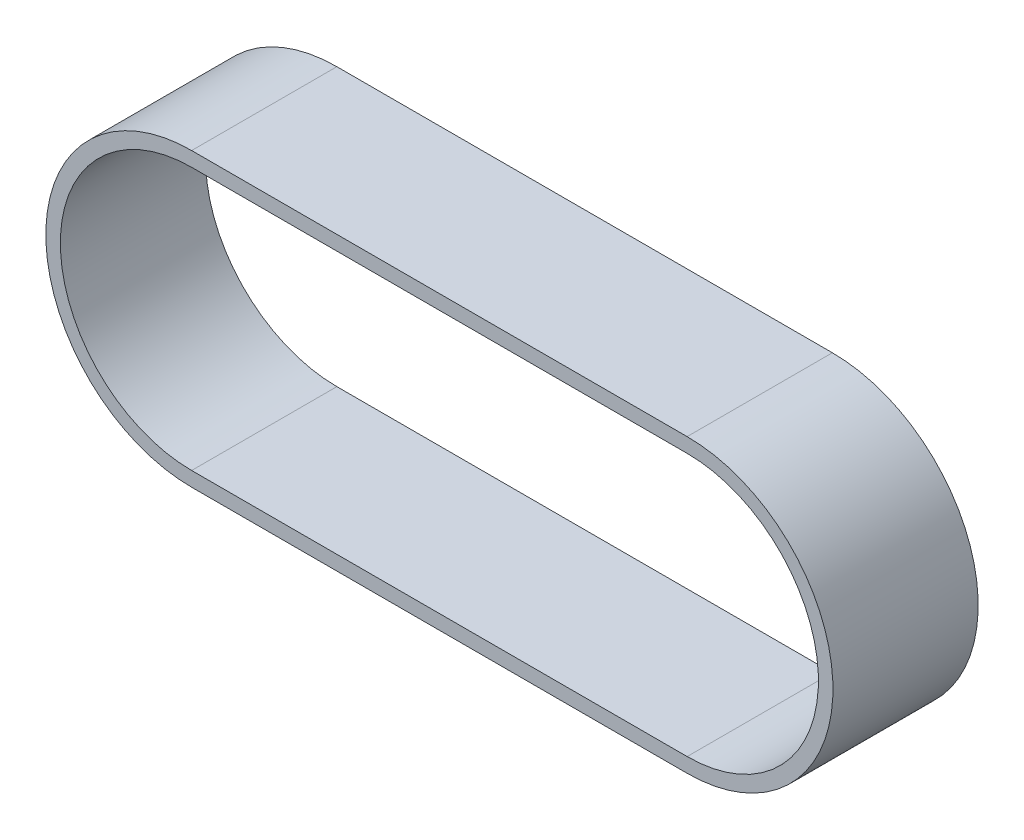
ISO-10303-21;
HEADER;
FILE_DESCRIPTION(('STEP AP214'),'2;1');
FILE_NAME('part.step','',(''),(''),'','','');
FILE_SCHEMA(('AUTOMOTIVE_DESIGN { 1 0 10303 214 1 1 1 1 }'));
ENDSEC;
DATA;
#1=APPLICATION_CONTEXT('core data for automotive mechanical design processes');
#2=APPLICATION_PROTOCOL_DEFINITION('international standard','automotive_design',2000,#1);
#3=PRODUCT_CONTEXT('',#1,'mechanical');
#4=PRODUCT('Part','Part','',(#3));
#5=PRODUCT_RELATED_PRODUCT_CATEGORY('part','',(#4));
#6=PRODUCT_DEFINITION_FORMATION('','',#4);
#7=PRODUCT_DEFINITION_CONTEXT('part definition',#1,'design');
#8=PRODUCT_DEFINITION('design','',#6,#7);
#9=PRODUCT_DEFINITION_SHAPE('','',#8);
#10=(LENGTH_UNIT() NAMED_UNIT(*) SI_UNIT(.MILLI.,.METRE.));
#11=(NAMED_UNIT(*) PLANE_ANGLE_UNIT() SI_UNIT($,.RADIAN.));
#12=(NAMED_UNIT(*) SI_UNIT($,.STERADIAN.) SOLID_ANGLE_UNIT());
#13=UNCERTAINTY_MEASURE_WITH_UNIT(LENGTH_MEASURE(1.E-05),#10,'distance_accuracy_value','');
#14=(GEOMETRIC_REPRESENTATION_CONTEXT(3) GLOBAL_UNCERTAINTY_ASSIGNED_CONTEXT((#13)) GLOBAL_UNIT_ASSIGNED_CONTEXT((#10,
#11,#12)) REPRESENTATION_CONTEXT('',''));
#15=CARTESIAN_POINT('',(0.,0.,0.));
#16=DIRECTION('',(0.,0.,1.));
#17=DIRECTION('',(1.,0.,0.));
#18=AXIS2_PLACEMENT_3D('',#15,#16,#17);
#19=CARTESIAN_POINT('',(17.06,0.,2.5));
#20=DIRECTION('',(0.,0.,1.));
#21=DIRECTION('',(1.,0.,0.));
#22=AXIS2_PLACEMENT_3D('',#19,#20,#21);
#23=PLANE('',#22);
#24=CARTESIAN_POINT('',(17.06,0.,2.5));
#25=DIRECTION('',(0.,0.,1.));
#26=DIRECTION('',(1.,0.,0.));
#27=AXIS2_PLACEMENT_3D('',#24,#25,#26);
#28=CIRCLE('',#27,5.02);
#29=CARTESIAN_POINT('',(17.06,-5.02,2.5));
#30=VERTEX_POINT('',#29);
#31=CARTESIAN_POINT('',(17.06,5.02,2.5));
#32=VERTEX_POINT('',#31);
#33=EDGE_CURVE('E135',#30,#32,#28,.T.);
#34=ORIENTED_EDGE('',*,*,#33,.T.);
#35=DIRECTION('',(-1.,0.,0.));
#36=VECTOR('',#35,1.);
#37=CARTESIAN_POINT('',(0.,5.02,2.5));
#38=LINE('',#37,#36);
#39=CARTESIAN_POINT('',(0.,5.02,2.5));
#40=VERTEX_POINT('',#39);
#41=EDGE_CURVE('E138',#32,#40,#38,.T.);
#42=ORIENTED_EDGE('',*,*,#41,.T.);
#43=CARTESIAN_POINT('',(0.,0.,2.5));
#44=DIRECTION('',(0.,0.,1.));
#45=DIRECTION('',(1.,0.,0.));
#46=AXIS2_PLACEMENT_3D('',#43,#44,#45);
#47=CIRCLE('',#46,5.02);
#48=CARTESIAN_POINT('',(0.,-5.02,2.5));
#49=VERTEX_POINT('',#48);
#50=EDGE_CURVE('E141',#40,#49,#47,.T.);
#51=ORIENTED_EDGE('',*,*,#50,.T.);
#52=DIRECTION('',(1.,0.,0.));
#53=VECTOR('',#52,1.);
#54=CARTESIAN_POINT('',(0.,-5.02,2.5));
#55=LINE('',#54,#53);
#56=EDGE_CURVE('E143',#49,#30,#55,.T.);
#57=ORIENTED_EDGE('',*,*,#56,.T.);
#58=EDGE_LOOP('',(#34,#42,#51,#57));
#59=FACE_BOUND('',#58,.T.);
#60=DIRECTION('',(1.,0.,0.));
#61=VECTOR('',#60,1.);
#62=CARTESIAN_POINT('',(0.,-4.52,2.5));
#63=LINE('',#62,#61);
#64=CARTESIAN_POINT('',(0.,-4.52,2.5));
#65=VERTEX_POINT('',#64);
#66=CARTESIAN_POINT('',(17.06,-4.52,2.5));
#67=VERTEX_POINT('',#66);
#68=EDGE_CURVE('E107',#65,#67,#63,.T.);
#69=ORIENTED_EDGE('',*,*,#68,.F.);
#70=CARTESIAN_POINT('',(0.,0.,2.5));
#71=DIRECTION('',(0.,0.,1.));
#72=DIRECTION('',(1.,0.,0.));
#73=AXIS2_PLACEMENT_3D('',#70,#71,#72);
#74=CIRCLE('',#73,4.52);
#75=CARTESIAN_POINT('',(0.,4.52,2.5));
#76=VERTEX_POINT('',#75);
#77=EDGE_CURVE('E99',#76,#65,#74,.T.);
#78=ORIENTED_EDGE('',*,*,#77,.F.);
#79=DIRECTION('',(-1.,0.,0.));
#80=VECTOR('',#79,1.);
#81=CARTESIAN_POINT('',(0.,4.52,2.5));
#82=LINE('',#81,#80);
#83=CARTESIAN_POINT('',(17.06,4.52,2.5));
#84=VERTEX_POINT('',#83);
#85=EDGE_CURVE('E121',#84,#76,#82,.T.);
#86=ORIENTED_EDGE('',*,*,#85,.F.);
#87=CARTESIAN_POINT('',(17.06,0.,2.5));
#88=DIRECTION('',(0.,0.,1.));
#89=DIRECTION('',(1.,0.,0.));
#90=AXIS2_PLACEMENT_3D('',#87,#88,#89);
#91=CIRCLE('',#90,4.52);
#92=EDGE_CURVE('E119',#67,#84,#91,.T.);
#93=ORIENTED_EDGE('',*,*,#92,.F.);
#94=EDGE_LOOP('',(#69,#78,#86,#93));
#95=FACE_BOUND('',#94,.T.);
#96=ADVANCED_FACE('F34',(#59,#95),#23,.T.);
#97=CARTESIAN_POINT('',(17.06,0.,-2.5));
#98=DIRECTION('',(0.,0.,1.));
#99=DIRECTION('',(1.,0.,0.));
#100=AXIS2_PLACEMENT_3D('',#97,#98,#99);
#101=PLANE('',#100);
#102=CARTESIAN_POINT('',(17.06,0.,-2.5));
#103=DIRECTION('',(0.,0.,1.));
#104=DIRECTION('',(1.,0.,0.));
#105=AXIS2_PLACEMENT_3D('',#102,#103,#104);
#106=CIRCLE('',#105,5.02);
#107=CARTESIAN_POINT('',(17.06,-5.02,-2.5));
#108=VERTEX_POINT('',#107);
#109=CARTESIAN_POINT('',(17.06,5.02,-2.5));
#110=VERTEX_POINT('',#109);
#111=EDGE_CURVE('E115',#108,#110,#106,.T.);
#112=ORIENTED_EDGE('',*,*,#111,.F.);
#113=DIRECTION('',(1.,0.,0.));
#114=VECTOR('',#113,1.);
#115=CARTESIAN_POINT('',(0.,-5.02,-2.5));
#116=LINE('',#115,#114);
#117=CARTESIAN_POINT('',(0.,-5.02,-2.5));
#118=VERTEX_POINT('',#117);
#119=EDGE_CURVE('E139',#118,#108,#116,.T.);
#120=ORIENTED_EDGE('',*,*,#119,.F.);
#121=CARTESIAN_POINT('',(0.,0.,-2.5));
#122=DIRECTION('',(0.,0.,1.));
#123=DIRECTION('',(1.,0.,0.));
#124=AXIS2_PLACEMENT_3D('',#121,#122,#123);
#125=CIRCLE('',#124,5.02);
#126=CARTESIAN_POINT('',(0.,5.02,-2.5));
#127=VERTEX_POINT('',#126);
#128=EDGE_CURVE('E150',#127,#118,#125,.T.);
#129=ORIENTED_EDGE('',*,*,#128,.F.);
#130=DIRECTION('',(-1.,0.,0.));
#131=VECTOR('',#130,1.);
#132=CARTESIAN_POINT('',(0.,5.02,-2.5));
#133=LINE('',#132,#131);
#134=EDGE_CURVE('E148',#110,#127,#133,.T.);
#135=ORIENTED_EDGE('',*,*,#134,.F.);
#136=EDGE_LOOP('',(#112,#120,#129,#135));
#137=FACE_BOUND('',#136,.T.);
#138=CARTESIAN_POINT('',(0.,0.,-2.5));
#139=DIRECTION('',(0.,0.,1.));
#140=DIRECTION('',(1.,0.,0.));
#141=AXIS2_PLACEMENT_3D('',#138,#139,#140);
#142=CIRCLE('',#141,4.52);
#143=CARTESIAN_POINT('',(0.,4.52,-2.5));
#144=VERTEX_POINT('',#143);
#145=CARTESIAN_POINT('',(0.,-4.52,-2.5));
#146=VERTEX_POINT('',#145);
#147=EDGE_CURVE('E57',#144,#146,#142,.T.);
#148=ORIENTED_EDGE('',*,*,#147,.T.);
#149=DIRECTION('',(1.,0.,0.));
#150=VECTOR('',#149,1.);
#151=CARTESIAN_POINT('',(0.,-4.52,-2.5));
#152=LINE('',#151,#150);
#153=CARTESIAN_POINT('',(17.06,-4.52,-2.5));
#154=VERTEX_POINT('',#153);
#155=EDGE_CURVE('E114',#146,#154,#152,.T.);
#156=ORIENTED_EDGE('',*,*,#155,.T.);
#157=CARTESIAN_POINT('',(17.06,0.,-2.5));
#158=DIRECTION('',(0.,0.,1.));
#159=DIRECTION('',(1.,0.,0.));
#160=AXIS2_PLACEMENT_3D('',#157,#158,#159);
#161=CIRCLE('',#160,4.52);
#162=CARTESIAN_POINT('',(17.06,4.52,-2.5));
#163=VERTEX_POINT('',#162);
#164=EDGE_CURVE('E127',#154,#163,#161,.T.);
#165=ORIENTED_EDGE('',*,*,#164,.T.);
#166=DIRECTION('',(-1.,0.,0.));
#167=VECTOR('',#166,1.);
#168=CARTESIAN_POINT('',(0.,4.52,-2.5));
#169=LINE('',#168,#167);
#170=EDGE_CURVE('E108',#163,#144,#169,.T.);
#171=ORIENTED_EDGE('',*,*,#170,.T.);
#172=EDGE_LOOP('',(#148,#156,#165,#171));
#173=FACE_BOUND('',#172,.T.);
#174=ADVANCED_FACE('F168',(#137,#173),#101,.F.);
#175=CARTESIAN_POINT('',(17.06,0.,2.5));
#176=DIRECTION('',(0.,0.,-1.));
#177=DIRECTION('',(-1.,0.,0.));
#178=AXIS2_PLACEMENT_3D('',#175,#176,#177);
#179=CYLINDRICAL_SURFACE('',#178,5.02);
#180=ORIENTED_EDGE('',*,*,#111,.T.);
#181=DIRECTION('',(0.,0.,-1.));
#182=VECTOR('',#181,1.);
#183=CARTESIAN_POINT('',(17.06,5.02,2.5));
#184=LINE('',#183,#182);
#185=EDGE_CURVE('E11',#32,#110,#184,.T.);
#186=ORIENTED_EDGE('',*,*,#185,.F.);
#187=ORIENTED_EDGE('',*,*,#33,.F.);
#188=DIRECTION('',(0.,0.,-1.));
#189=VECTOR('',#188,1.);
#190=CARTESIAN_POINT('',(17.06,-5.02,2.5));
#191=LINE('',#190,#189);
#192=EDGE_CURVE('E145',#30,#108,#191,.T.);
#193=ORIENTED_EDGE('',*,*,#192,.T.);
#194=EDGE_LOOP('',(#180,#186,#187,#193));
#195=FACE_BOUND('',#194,.T.);
#196=ADVANCED_FACE('F36',(#195),#179,.T.);
#197=CARTESIAN_POINT('',(0.,5.02,2.5));
#198=DIRECTION('',(0.,-1.,0.));
#199=DIRECTION('',(1.,0.,0.));
#200=AXIS2_PLACEMENT_3D('',#197,#198,#199);
#201=PLANE('',#200);
#202=ORIENTED_EDGE('',*,*,#134,.T.);
#203=DIRECTION('',(0.,0.,-1.));
#204=VECTOR('',#203,1.);
#205=CARTESIAN_POINT('',(0.,5.02,2.5));
#206=LINE('',#205,#204);
#207=EDGE_CURVE('E42',#40,#127,#206,.T.);
#208=ORIENTED_EDGE('',*,*,#207,.F.);
#209=ORIENTED_EDGE('',*,*,#41,.F.);
#210=ORIENTED_EDGE('',*,*,#185,.T.);
#211=EDGE_LOOP('',(#202,#208,#209,#210));
#212=FACE_BOUND('',#211,.T.);
#213=ADVANCED_FACE('F178',(#212),#201,.F.);
#214=CARTESIAN_POINT('',(0.,0.,2.5));
#215=DIRECTION('',(0.,0.,-1.));
#216=DIRECTION('',(-1.,0.,0.));
#217=AXIS2_PLACEMENT_3D('',#214,#215,#216);
#218=CYLINDRICAL_SURFACE('',#217,5.02);
#219=ORIENTED_EDGE('',*,*,#128,.T.);
#220=DIRECTION('',(0.,0.,-1.));
#221=VECTOR('',#220,1.);
#222=CARTESIAN_POINT('',(0.,-5.02,2.5));
#223=LINE('',#222,#221);
#224=EDGE_CURVE('E155',#49,#118,#223,.T.);
#225=ORIENTED_EDGE('',*,*,#224,.F.);
#226=ORIENTED_EDGE('',*,*,#50,.F.);
#227=ORIENTED_EDGE('',*,*,#207,.T.);
#228=EDGE_LOOP('',(#219,#225,#226,#227));
#229=FACE_BOUND('',#228,.T.);
#230=ADVANCED_FACE('F162',(#229),#218,.T.);
#231=CARTESIAN_POINT('',(0.,-5.02,2.5));
#232=DIRECTION('',(0.,1.,0.));
#233=DIRECTION('',(-1.,0.,0.));
#234=AXIS2_PLACEMENT_3D('',#231,#232,#233);
#235=PLANE('',#234);
#236=ORIENTED_EDGE('',*,*,#119,.T.);
#237=ORIENTED_EDGE('',*,*,#192,.F.);
#238=ORIENTED_EDGE('',*,*,#56,.F.);
#239=ORIENTED_EDGE('',*,*,#224,.T.);
#240=EDGE_LOOP('',(#236,#237,#238,#239));
#241=FACE_BOUND('',#240,.T.);
#242=ADVANCED_FACE('F172',(#241),#235,.F.);
#243=CARTESIAN_POINT('',(0.,0.,2.5));
#244=DIRECTION('',(0.,0.,-1.));
#245=DIRECTION('',(-1.,0.,0.));
#246=AXIS2_PLACEMENT_3D('',#243,#244,#245);
#247=CYLINDRICAL_SURFACE('',#246,4.52);
#248=ORIENTED_EDGE('',*,*,#147,.F.);
#249=DIRECTION('',(0.,0.,-1.));
#250=VECTOR('',#249,1.);
#251=CARTESIAN_POINT('',(0.,4.52,2.5));
#252=LINE('',#251,#250);
#253=EDGE_CURVE('E103',#76,#144,#252,.T.);
#254=ORIENTED_EDGE('',*,*,#253,.F.);
#255=ORIENTED_EDGE('',*,*,#77,.T.);
#256=DIRECTION('',(0.,0.,-1.));
#257=VECTOR('',#256,1.);
#258=CARTESIAN_POINT('',(0.,-4.52,2.5));
#259=LINE('',#258,#257);
#260=EDGE_CURVE('E102',#65,#146,#259,.T.);
#261=ORIENTED_EDGE('',*,*,#260,.T.);
#262=EDGE_LOOP('',(#248,#254,#255,#261));
#263=FACE_BOUND('',#262,.T.);
#264=ADVANCED_FACE('F101',(#263),#247,.F.);
#265=CARTESIAN_POINT('',(0.,-4.52,2.5));
#266=DIRECTION('',(0.,1.,0.));
#267=DIRECTION('',(0.,0.,1.));
#268=AXIS2_PLACEMENT_3D('',#265,#266,#267);
#269=PLANE('',#268);
#270=ORIENTED_EDGE('',*,*,#155,.F.);
#271=ORIENTED_EDGE('',*,*,#260,.F.);
#272=ORIENTED_EDGE('',*,*,#68,.T.);
#273=DIRECTION('',(0.,0.,-1.));
#274=VECTOR('',#273,1.);
#275=CARTESIAN_POINT('',(17.06,-4.52,2.5));
#276=LINE('',#275,#274);
#277=EDGE_CURVE('E116',#67,#154,#276,.T.);
#278=ORIENTED_EDGE('',*,*,#277,.T.);
#279=EDGE_LOOP('',(#270,#271,#272,#278));
#280=FACE_BOUND('',#279,.T.);
#281=ADVANCED_FACE('F111',(#280),#269,.T.);
#282=CARTESIAN_POINT('',(17.06,0.,2.5));
#283=DIRECTION('',(0.,0.,-1.));
#284=DIRECTION('',(-1.,0.,0.));
#285=AXIS2_PLACEMENT_3D('',#282,#283,#284);
#286=CYLINDRICAL_SURFACE('',#285,4.52);
#287=ORIENTED_EDGE('',*,*,#164,.F.);
#288=ORIENTED_EDGE('',*,*,#277,.F.);
#289=ORIENTED_EDGE('',*,*,#92,.T.);
#290=DIRECTION('',(0.,0.,-1.));
#291=VECTOR('',#290,1.);
#292=CARTESIAN_POINT('',(17.06,4.52,2.5));
#293=LINE('',#292,#291);
#294=EDGE_CURVE('E49',#84,#163,#293,.T.);
#295=ORIENTED_EDGE('',*,*,#294,.T.);
#296=EDGE_LOOP('',(#287,#288,#289,#295));
#297=FACE_BOUND('',#296,.T.);
#298=ADVANCED_FACE('F201',(#297),#286,.F.);
#299=CARTESIAN_POINT('',(0.,4.52,2.5));
#300=DIRECTION('',(0.,-1.,0.));
#301=DIRECTION('',(0.,0.,-1.));
#302=AXIS2_PLACEMENT_3D('',#299,#300,#301);
#303=PLANE('',#302);
#304=ORIENTED_EDGE('',*,*,#170,.F.);
#305=ORIENTED_EDGE('',*,*,#294,.F.);
#306=ORIENTED_EDGE('',*,*,#85,.T.);
#307=ORIENTED_EDGE('',*,*,#253,.T.);
#308=EDGE_LOOP('',(#304,#305,#306,#307));
#309=FACE_BOUND('',#308,.T.);
#310=ADVANCED_FACE('F205',(#309),#303,.T.);
#311=CLOSED_SHELL('',(#96,#174,#196,#213,#230,#242,#264,#281,#298,#310));
#312=MANIFOLD_SOLID_BREP('B2',#311);
#313=ADVANCED_BREP_SHAPE_REPRESENTATION('',(#18,#312),#14);
#314=SHAPE_DEFINITION_REPRESENTATION(#9,#313);
ENDSEC;
END-ISO-10303-21;
